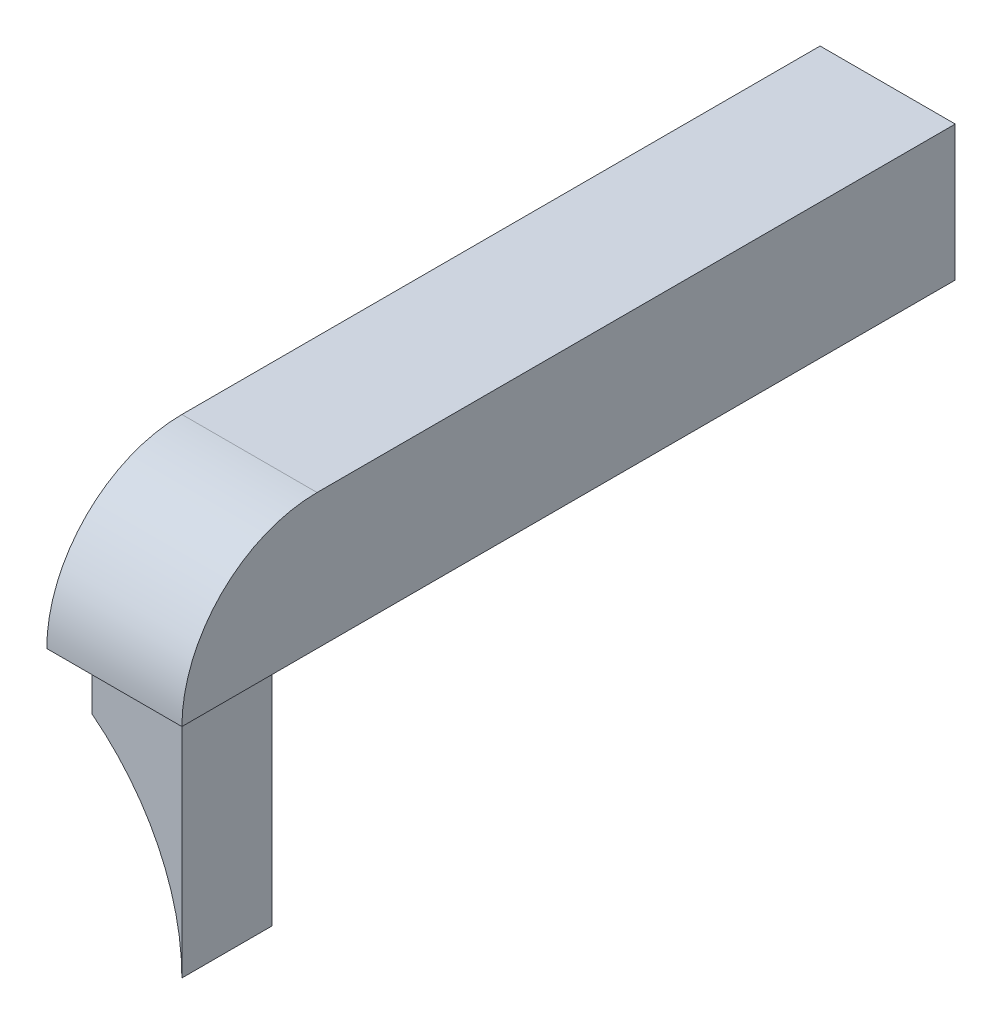
ISO-10303-21;
HEADER;
FILE_DESCRIPTION(('STEP AP214'),'2;1');
FILE_NAME('part.step','',(''),(''),'','','');
FILE_SCHEMA(('AUTOMOTIVE_DESIGN { 1 0 10303 214 1 1 1 1 }'));
ENDSEC;
DATA;
#1=APPLICATION_CONTEXT('core data for automotive mechanical design processes');
#2=APPLICATION_PROTOCOL_DEFINITION('international standard','automotive_design',2000,#1);
#3=PRODUCT_CONTEXT('',#1,'mechanical');
#4=PRODUCT('Part','Part','',(#3));
#5=PRODUCT_RELATED_PRODUCT_CATEGORY('part','',(#4));
#6=PRODUCT_DEFINITION_FORMATION('','',#4);
#7=PRODUCT_DEFINITION_CONTEXT('part definition',#1,'design');
#8=PRODUCT_DEFINITION('design','',#6,#7);
#9=PRODUCT_DEFINITION_SHAPE('','',#8);
#10=(LENGTH_UNIT() NAMED_UNIT(*) SI_UNIT(.MILLI.,.METRE.));
#11=(NAMED_UNIT(*) PLANE_ANGLE_UNIT() SI_UNIT($,.RADIAN.));
#12=(NAMED_UNIT(*) SI_UNIT($,.STERADIAN.) SOLID_ANGLE_UNIT());
#13=UNCERTAINTY_MEASURE_WITH_UNIT(LENGTH_MEASURE(1.E-05),#10,'distance_accuracy_value','');
#14=(GEOMETRIC_REPRESENTATION_CONTEXT(3) GLOBAL_UNCERTAINTY_ASSIGNED_CONTEXT((#13)) GLOBAL_UNIT_ASSIGNED_CONTEXT((#10,
#11,#12)) REPRESENTATION_CONTEXT('',''));
#15=CARTESIAN_POINT('',(0.,0.,0.));
#16=DIRECTION('',(0.,0.,1.));
#17=DIRECTION('',(1.,0.,0.));
#18=AXIS2_PLACEMENT_3D('',#15,#16,#17);
#19=CARTESIAN_POINT('',(13.7705009063984,28.2267058219209,96.5230796597994));
#20=DIRECTION('',(1.,0.,0.));
#21=DIRECTION('',(0.,0.,-1.));
#22=AXIS2_PLACEMENT_3D('',#19,#20,#21);
#23=CYLINDRICAL_SURFACE('',#22,12.4641016151377);
#24=CARTESIAN_POINT('',(26.2346025215362,28.2267058219209,96.5230796597994));
#25=DIRECTION('',(-1.,0.,0.));
#26=DIRECTION('',(0.,0.,1.));
#27=AXIS2_PLACEMENT_3D('',#24,#25,#26);
#28=CIRCLE('',#27,12.4641016151377);
#29=CARTESIAN_POINT('',(26.2346025215362,40.6908074370587,96.5230796597994));
#30=VERTEX_POINT('',#29);
#31=CARTESIAN_POINT('',(26.2346025215362,34.775828248986,107.127928763289));
#32=VERTEX_POINT('',#31);
#33=EDGE_CURVE('E249',#30,#32,#28,.F.);
#34=ORIENTED_EDGE('',*,*,#33,.T.);
#35=DIRECTION('',(1.,0.,0.));
#36=VECTOR('',#35,1.);
#37=CARTESIAN_POINT('',(13.7705009063984,34.775828248986,107.127928763289));
#38=LINE('',#37,#36);
#39=CARTESIAN_POINT('',(19.3063992912607,34.775828248986,107.127928763289));
#40=VERTEX_POINT('',#39);
#41=EDGE_CURVE('E61',#32,#40,#38,.F.);
#42=ORIENTED_EDGE('',*,*,#41,.T.);
#43=CARTESIAN_POINT('',(19.3063992912607,28.2267058219209,96.5230796597994));
#44=DIRECTION('',(1.,0.,0.));
#45=DIRECTION('',(0.,0.,-1.));
#46=AXIS2_PLACEMENT_3D('',#43,#44,#45);
#47=CIRCLE('',#46,12.4641016151377);
#48=CARTESIAN_POINT('',(19.3063992912607,40.6908074370587,96.5230796597994));
#49=VERTEX_POINT('',#48);
#50=EDGE_CURVE('E250',#49,#40,#47,.T.);
#51=ORIENTED_EDGE('',*,*,#50,.F.);
#52=DIRECTION('',(1.,0.,0.));
#53=VECTOR('',#52,1.);
#54=CARTESIAN_POINT('',(13.7705009063984,40.6908074370587,96.5230796597994));
#55=LINE('',#54,#53);
#56=EDGE_CURVE('E263',#49,#30,#55,.T.);
#57=ORIENTED_EDGE('',*,*,#56,.T.);
#58=EDGE_LOOP('',(#34,#42,#51,#57));
#59=FACE_BOUND('',#58,.T.);
#60=ADVANCED_FACE('F39',(#59),#23,.F.);
#61=CARTESIAN_POINT('',(13.7705009063984,46.2267058219209,11.5230796597994));
#62=DIRECTION('',(0.,0.,-1.));
#63=DIRECTION('',(-1.,0.,0.));
#64=AXIS2_PLACEMENT_3D('',#61,#62,#63);
#65=PLANE('',#64);
#66=DIRECTION('',(0.,1.,0.));
#67=VECTOR('',#66,1.);
#68=CARTESIAN_POINT('',(31.7705009063984,46.2267058219209,11.5230796597994));
#69=LINE('',#68,#67);
#70=CARTESIAN_POINT('',(31.7705009063984,28.2267058219209,11.5230796597994));
#71=VERTEX_POINT('',#70);
#72=CARTESIAN_POINT('',(31.7705009063984,46.2267058219209,11.5230796597994));
#73=VERTEX_POINT('',#72);
#74=EDGE_CURVE('E301',#71,#73,#69,.T.);
#75=ORIENTED_EDGE('',*,*,#74,.F.);
#76=DIRECTION('',(1.,0.,0.));
#77=VECTOR('',#76,1.);
#78=CARTESIAN_POINT('',(13.7705009063984,28.2267058219209,11.5230796597994));
#79=LINE('',#78,#77);
#80=CARTESIAN_POINT('',(13.7705009063984,28.2267058219209,11.5230796597994));
#81=VERTEX_POINT('',#80);
#82=EDGE_CURVE('E298',#81,#71,#79,.T.);
#83=ORIENTED_EDGE('',*,*,#82,.F.);
#84=DIRECTION('',(0.,1.,0.));
#85=VECTOR('',#84,1.);
#86=CARTESIAN_POINT('',(13.7705009063984,46.2267058219209,11.5230796597994));
#87=LINE('',#86,#85);
#88=CARTESIAN_POINT('',(13.7705009063984,46.2267058219209,11.5230796597994));
#89=VERTEX_POINT('',#88);
#90=EDGE_CURVE('E285',#81,#89,#87,.T.);
#91=ORIENTED_EDGE('',*,*,#90,.T.);
#92=DIRECTION('',(1.,0.,0.));
#93=VECTOR('',#92,1.);
#94=CARTESIAN_POINT('',(13.7705009063984,46.2267058219209,11.5230796597994));
#95=LINE('',#94,#93);
#96=EDGE_CURVE('E316',#89,#73,#95,.T.);
#97=ORIENTED_EDGE('',*,*,#96,.T.);
#98=EDGE_LOOP('',(#75,#83,#91,#97));
#99=FACE_BOUND('',#98,.T.);
#100=DIRECTION('',(1.,0.,0.));
#101=VECTOR('',#100,1.);
#102=CARTESIAN_POINT('',(13.7705009063984,33.7626042067832,11.5230796597994));
#103=LINE('',#102,#101);
#104=CARTESIAN_POINT('',(19.3063992912607,33.7626042067832,11.5230796597994));
#105=VERTEX_POINT('',#104);
#106=CARTESIAN_POINT('',(26.2346025215362,33.7626042067832,11.5230796597994));
#107=VERTEX_POINT('',#106);
#108=EDGE_CURVE('E253',#105,#107,#103,.T.);
#109=ORIENTED_EDGE('',*,*,#108,.T.);
#110=DIRECTION('',(0.,1.,0.));
#111=VECTOR('',#110,1.);
#112=CARTESIAN_POINT('',(26.2346025215362,46.2267058219209,11.5230796597994));
#113=LINE('',#112,#111);
#114=CARTESIAN_POINT('',(26.2346025215362,40.6908074370587,11.5230796597994));
#115=VERTEX_POINT('',#114);
#116=EDGE_CURVE('E262',#107,#115,#113,.T.);
#117=ORIENTED_EDGE('',*,*,#116,.T.);
#118=DIRECTION('',(1.,0.,0.));
#119=VECTOR('',#118,1.);
#120=CARTESIAN_POINT('',(13.7705009063984,40.6908074370587,11.5230796597994));
#121=LINE('',#120,#119);
#122=CARTESIAN_POINT('',(19.3063992912607,40.6908074370587,11.5230796597994));
#123=VERTEX_POINT('',#122);
#124=EDGE_CURVE('E267',#123,#115,#121,.T.);
#125=ORIENTED_EDGE('',*,*,#124,.F.);
#126=DIRECTION('',(0.,1.,0.));
#127=VECTOR('',#126,1.);
#128=CARTESIAN_POINT('',(19.3063992912607,28.2267058219209,11.5230796597994));
#129=LINE('',#128,#127);
#130=EDGE_CURVE('E248',#105,#123,#129,.T.);
#131=ORIENTED_EDGE('',*,*,#130,.F.);
#132=EDGE_LOOP('',(#109,#117,#125,#131));
#133=FACE_BOUND('',#132,.T.);
#134=ADVANCED_FACE('F361',(#99,#133),#65,.T.);
#135=CARTESIAN_POINT('',(13.7705009063984,28.2267058219209,114.523079659799));
#136=DIRECTION('',(1.,0.,0.));
#137=DIRECTION('',(0.,0.,-1.));
#138=AXIS2_PLACEMENT_3D('',#135,#136,#137);
#139=PLANE('',#138);
#140=DIRECTION('',(0.,0.,-1.));
#141=VECTOR('',#140,1.);
#142=CARTESIAN_POINT('',(13.7705009063984,28.2267058219209,114.523079659799));
#143=LINE('',#142,#141);
#144=CARTESIAN_POINT('',(13.7705009063984,28.2267058219209,114.523079659799));
#145=VERTEX_POINT('',#144);
#146=EDGE_CURVE('E282',#145,#81,#143,.T.);
#147=ORIENTED_EDGE('',*,*,#146,.F.);
#148=CARTESIAN_POINT('',(13.7705009063984,28.2267058219209,96.5230796597994));
#149=DIRECTION('',(1.,0.,0.));
#150=DIRECTION('',(0.,0.,1.));
#151=AXIS2_PLACEMENT_3D('',#148,#149,#150);
#152=CIRCLE('',#151,18.);
#153=CARTESIAN_POINT('',(13.7705009063984,46.2267058219209,96.5230796597994));
#154=VERTEX_POINT('',#153);
#155=EDGE_CURVE('E294',#154,#145,#152,.T.);
#156=ORIENTED_EDGE('',*,*,#155,.F.);
#157=DIRECTION('',(0.,0.,1.));
#158=VECTOR('',#157,1.);
#159=CARTESIAN_POINT('',(13.7705009063984,46.2267058219209,96.5230796597994));
#160=LINE('',#159,#158);
#161=EDGE_CURVE('E290',#89,#154,#160,.T.);
#162=ORIENTED_EDGE('',*,*,#161,.F.);
#163=ORIENTED_EDGE('',*,*,#90,.F.);
#164=EDGE_LOOP('',(#147,#156,#162,#163));
#165=FACE_BOUND('',#164,.T.);
#166=ADVANCED_FACE('F368',(#165),#139,.F.);
#167=CARTESIAN_POINT('',(13.7705009063984,46.2267058219209,96.5230796597994));
#168=DIRECTION('',(0.,1.,0.));
#169=DIRECTION('',(0.,0.,1.));
#170=AXIS2_PLACEMENT_3D('',#167,#168,#169);
#171=PLANE('',#170);
#172=DIRECTION('',(0.,0.,1.));
#173=VECTOR('',#172,1.);
#174=CARTESIAN_POINT('',(31.7705009063984,46.2267058219209,96.5230796597994));
#175=LINE('',#174,#173);
#176=CARTESIAN_POINT('',(31.7705009063984,46.2267058219209,96.5230796597994));
#177=VERTEX_POINT('',#176);
#178=EDGE_CURVE('E305',#73,#177,#175,.T.);
#179=ORIENTED_EDGE('',*,*,#178,.F.);
#180=ORIENTED_EDGE('',*,*,#96,.F.);
#181=ORIENTED_EDGE('',*,*,#161,.T.);
#182=DIRECTION('',(1.,0.,0.));
#183=VECTOR('',#182,1.);
#184=CARTESIAN_POINT('',(13.7705009063984,46.2267058219209,96.5230796597994));
#185=LINE('',#184,#183);
#186=EDGE_CURVE('E312',#154,#177,#185,.T.);
#187=ORIENTED_EDGE('',*,*,#186,.T.);
#188=EDGE_LOOP('',(#179,#180,#181,#187));
#189=FACE_BOUND('',#188,.T.);
#190=ADVANCED_FACE('F384',(#189),#171,.T.);
#191=CARTESIAN_POINT('',(31.7705009063984,28.2267058219209,114.523079659799));
#192=DIRECTION('',(-1.,0.,0.));
#193=DIRECTION('',(0.,0.,1.));
#194=AXIS2_PLACEMENT_3D('',#191,#192,#193);
#195=PLANE('',#194);
#196=CARTESIAN_POINT('',(31.7705009063984,28.2267058219209,96.5230796597994));
#197=DIRECTION('',(1.,0.,0.));
#198=DIRECTION('',(0.,0.,1.));
#199=AXIS2_PLACEMENT_3D('',#196,#197,#198);
#200=CIRCLE('',#199,18.);
#201=CARTESIAN_POINT('',(31.7705009063984,28.2267058219209,114.523079659799));
#202=VERTEX_POINT('',#201);
#203=EDGE_CURVE('E286',#177,#202,#200,.T.);
#204=ORIENTED_EDGE('',*,*,#203,.T.);
#205=DIRECTION('',(0.,0.,-1.));
#206=VECTOR('',#205,1.);
#207=CARTESIAN_POINT('',(31.7705009063984,28.2267058219209,96.5230796597994));
#208=LINE('',#207,#206);
#209=EDGE_CURVE('E266',#202,#71,#208,.T.);
#210=ORIENTED_EDGE('',*,*,#209,.T.);
#211=ORIENTED_EDGE('',*,*,#74,.T.);
#212=ORIENTED_EDGE('',*,*,#178,.T.);
#213=EDGE_LOOP('',(#204,#210,#211,#212));
#214=FACE_BOUND('',#213,.T.);
#215=ADVANCED_FACE('F382',(#214),#195,.F.);
#216=CARTESIAN_POINT('',(13.7705009063984,28.2267058219209,96.5230796597994));
#217=DIRECTION('',(1.,0.,0.));
#218=DIRECTION('',(0.,0.,-1.));
#219=AXIS2_PLACEMENT_3D('',#216,#217,#218);
#220=CYLINDRICAL_SURFACE('',#219,18.);
#221=ORIENTED_EDGE('',*,*,#203,.F.);
#222=ORIENTED_EDGE('',*,*,#186,.F.);
#223=ORIENTED_EDGE('',*,*,#155,.T.);
#224=DIRECTION('',(1.,0.,0.));
#225=VECTOR('',#224,1.);
#226=CARTESIAN_POINT('',(13.7705009063984,28.2267058219209,114.523079659799));
#227=LINE('',#226,#225);
#228=EDGE_CURVE('E315',#145,#202,#227,.T.);
#229=ORIENTED_EDGE('',*,*,#228,.T.);
#230=EDGE_LOOP('',(#221,#222,#223,#229));
#231=FACE_BOUND('',#230,.T.);
#232=ADVANCED_FACE('F379',(#231),#220,.T.);
#233=CARTESIAN_POINT('',(13.7705009063984,28.2267058219209,96.5230796597994));
#234=DIRECTION('',(0.,-1.,0.));
#235=DIRECTION('',(0.,0.,-1.));
#236=AXIS2_PLACEMENT_3D('',#233,#234,#235);
#237=PLANE('',#236);
#238=DIRECTION('',(-1.,0.,0.));
#239=VECTOR('',#238,1.);
#240=CARTESIAN_POINT('',(28.7705009063984,28.2267058219209,111.523079659799));
#241=LINE('',#240,#239);
#242=CARTESIAN_POINT('',(28.7705009063984,28.2267058219209,111.523079659799));
#243=VERTEX_POINT('',#242);
#244=CARTESIAN_POINT('',(16.7705009063984,28.2267058219209,111.523079659799));
#245=VERTEX_POINT('',#244);
#246=EDGE_CURVE('E210',#243,#245,#241,.T.);
#247=ORIENTED_EDGE('',*,*,#246,.F.);
#248=DIRECTION('',(0.,0.,-1.));
#249=VECTOR('',#248,1.);
#250=CARTESIAN_POINT('',(28.7705009063984,28.2267058219209,111.523079659799));
#251=LINE('',#250,#249);
#252=CARTESIAN_POINT('',(28.7705009063984,28.2267058219209,99.5230796597994));
#253=VERTEX_POINT('',#252);
#254=EDGE_CURVE('E236',#243,#253,#251,.T.);
#255=ORIENTED_EDGE('',*,*,#254,.T.);
#256=DIRECTION('',(-1.,0.,0.));
#257=VECTOR('',#256,1.);
#258=CARTESIAN_POINT('',(28.7705009063984,28.2267058219209,99.5230796597994));
#259=LINE('',#258,#257);
#260=CARTESIAN_POINT('',(16.7705009063984,28.2267058219209,99.5230796597994));
#261=VERTEX_POINT('',#260);
#262=EDGE_CURVE('E223',#253,#261,#259,.T.);
#263=ORIENTED_EDGE('',*,*,#262,.T.);
#264=DIRECTION('',(0.,0.,-1.));
#265=VECTOR('',#264,1.);
#266=CARTESIAN_POINT('',(16.7705009063984,28.2267058219209,111.523079659799));
#267=LINE('',#266,#265);
#268=EDGE_CURVE('E232',#245,#261,#267,.T.);
#269=ORIENTED_EDGE('',*,*,#268,.F.);
#270=EDGE_LOOP('',(#247,#255,#263,#269));
#271=FACE_BOUND('',#270,.T.);
#272=ORIENTED_EDGE('',*,*,#209,.F.);
#273=ORIENTED_EDGE('',*,*,#228,.F.);
#274=ORIENTED_EDGE('',*,*,#146,.T.);
#275=ORIENTED_EDGE('',*,*,#82,.T.);
#276=EDGE_LOOP('',(#272,#273,#274,#275));
#277=FACE_BOUND('',#276,.T.);
#278=ADVANCED_FACE('F371',(#271,#277),#237,.T.);
#279=CARTESIAN_POINT('',(19.3063992912607,28.2267058219209,114.523079659799));
#280=DIRECTION('',(1.,0.,0.));
#281=DIRECTION('',(0.,0.,-1.));
#282=AXIS2_PLACEMENT_3D('',#279,#280,#281);
#283=PLANE('',#282);
#284=DIRECTION('',(0.,-1.,0.));
#285=VECTOR('',#284,1.);
#286=CARTESIAN_POINT('',(19.3063992912607,33.8267058219209,102.058978044662));
#287=LINE('',#286,#285);
#288=CARTESIAN_POINT('',(19.3063992912607,33.7626042067832,102.058978044662));
#289=VERTEX_POINT('',#288);
#290=CARTESIAN_POINT('',(19.3063992912607,18.5248017217256,102.058978044662));
#291=VERTEX_POINT('',#290);
#292=EDGE_CURVE('E187',#289,#291,#287,.T.);
#293=ORIENTED_EDGE('',*,*,#292,.F.);
#294=DIRECTION('',(0.,0.,-1.));
#295=VECTOR('',#294,1.);
#296=CARTESIAN_POINT('',(19.3063992912607,33.7626042067832,114.523079659799));
#297=LINE('',#296,#295);
#298=EDGE_CURVE('E245',#289,#105,#297,.T.);
#299=ORIENTED_EDGE('',*,*,#298,.T.);
#300=ORIENTED_EDGE('',*,*,#130,.T.);
#301=DIRECTION('',(0.,0.,1.));
#302=VECTOR('',#301,1.);
#303=CARTESIAN_POINT('',(19.3063992912607,40.6908074370587,114.523079659799));
#304=LINE('',#303,#302);
#305=EDGE_CURVE('E254',#123,#49,#304,.T.);
#306=ORIENTED_EDGE('',*,*,#305,.T.);
#307=ORIENTED_EDGE('',*,*,#50,.T.);
#308=CARTESIAN_POINT('',(19.3063992912607,35.8267058219209,108.829591575571));
#309=DIRECTION('',(1.,0.,0.));
#310=DIRECTION('',(0.,0.,-1.));
#311=AXIS2_PLACEMENT_3D('',#308,#309,#310);
#312=CIRCLE('',#311,2.);
#313=CARTESIAN_POINT('',(19.3063992912607,33.8267058219209,108.829591575571));
#314=VERTEX_POINT('',#313);
#315=EDGE_CURVE('E11',#40,#314,#312,.F.);
#316=ORIENTED_EDGE('',*,*,#315,.T.);
#317=DIRECTION('',(0.,0.,-1.));
#318=VECTOR('',#317,1.);
#319=CARTESIAN_POINT('',(19.3063992912607,33.8267058219209,108.987181274937));
#320=LINE('',#319,#318);
#321=CARTESIAN_POINT('',(19.3063992912607,33.8267058219209,108.987181274937));
#322=VERTEX_POINT('',#321);
#323=EDGE_CURVE('E168',#322,#314,#320,.T.);
#324=ORIENTED_EDGE('',*,*,#323,.F.);
#325=DIRECTION('',(0.,-1.,0.));
#326=VECTOR('',#325,1.);
#327=CARTESIAN_POINT('',(19.3063992912607,33.8267058219209,108.987181274937));
#328=LINE('',#327,#326);
#329=CARTESIAN_POINT('',(19.3063992912607,18.5248017217256,108.987181274937));
#330=VERTEX_POINT('',#329);
#331=EDGE_CURVE('E180',#322,#330,#328,.T.);
#332=ORIENTED_EDGE('',*,*,#331,.T.);
#333=DIRECTION('',(0.,0.,-1.));
#334=VECTOR('',#333,1.);
#335=CARTESIAN_POINT('',(19.3063992912607,18.5248017217256,111.523079659799));
#336=LINE('',#335,#334);
#337=EDGE_CURVE('E334',#291,#330,#336,.F.);
#338=ORIENTED_EDGE('',*,*,#337,.F.);
#339=EDGE_LOOP('',(#293,#299,#300,#306,#307,#316,#324,#332,#338));
#340=FACE_BOUND('',#339,.T.);
#341=ADVANCED_FACE('F348',(#340),#283,.T.);
#342=CARTESIAN_POINT('',(13.7705009063984,40.6908074370587,96.5230796597994));
#343=DIRECTION('',(0.,1.,0.));
#344=DIRECTION('',(0.,0.,1.));
#345=AXIS2_PLACEMENT_3D('',#342,#343,#344);
#346=PLANE('',#345);
#347=DIRECTION('',(0.,0.,1.));
#348=VECTOR('',#347,1.);
#349=CARTESIAN_POINT('',(26.2346025215362,40.6908074370587,96.5230796597994));
#350=LINE('',#349,#348);
#351=EDGE_CURVE('E258',#115,#30,#350,.T.);
#352=ORIENTED_EDGE('',*,*,#351,.T.);
#353=ORIENTED_EDGE('',*,*,#56,.F.);
#354=ORIENTED_EDGE('',*,*,#305,.F.);
#355=ORIENTED_EDGE('',*,*,#124,.T.);
#356=EDGE_LOOP('',(#352,#353,#354,#355));
#357=FACE_BOUND('',#356,.T.);
#358=ADVANCED_FACE('F414',(#357),#346,.F.);
#359=CARTESIAN_POINT('',(26.2346025215362,28.2267058219209,114.523079659799));
#360=DIRECTION('',(-1.,0.,0.));
#361=DIRECTION('',(0.,0.,1.));
#362=AXIS2_PLACEMENT_3D('',#359,#360,#361);
#363=PLANE('',#362);
#364=DIRECTION('',(0.,0.,-1.));
#365=VECTOR('',#364,1.);
#366=CARTESIAN_POINT('',(26.2346025215362,33.7626042067832,96.5230796597994));
#367=LINE('',#366,#365);
#368=CARTESIAN_POINT('',(26.2346025215362,33.7626042067832,102.058978044662));
#369=VERTEX_POINT('',#368);
#370=EDGE_CURVE('E244',#369,#107,#367,.T.);
#371=ORIENTED_EDGE('',*,*,#370,.F.);
#372=DIRECTION('',(0.,-1.,0.));
#373=VECTOR('',#372,1.);
#374=CARTESIAN_POINT('',(26.2346025215362,33.8267058219209,102.058978044662));
#375=LINE('',#374,#373);
#376=CARTESIAN_POINT('',(26.2346025215362,8.50656409647403,102.058978044662));
#377=VERTEX_POINT('',#376);
#378=EDGE_CURVE('E181',#369,#377,#375,.T.);
#379=ORIENTED_EDGE('',*,*,#378,.T.);
#380=DIRECTION('',(0.,0.,-1.));
#381=VECTOR('',#380,1.);
#382=CARTESIAN_POINT('',(26.2346025215362,8.50656409647403,111.523079659799));
#383=LINE('',#382,#381);
#384=CARTESIAN_POINT('',(26.2346025215362,8.50656409647403,108.987181274937));
#385=VERTEX_POINT('',#384);
#386=EDGE_CURVE('E176',#385,#377,#383,.T.);
#387=ORIENTED_EDGE('',*,*,#386,.F.);
#388=DIRECTION('',(0.,-1.,0.));
#389=VECTOR('',#388,1.);
#390=CARTESIAN_POINT('',(26.2346025215362,33.8267058219209,108.987181274937));
#391=LINE('',#390,#389);
#392=CARTESIAN_POINT('',(26.2346025215362,33.8267058219209,108.987181274937));
#393=VERTEX_POINT('',#392);
#394=EDGE_CURVE('E171',#393,#385,#391,.T.);
#395=ORIENTED_EDGE('',*,*,#394,.F.);
#396=DIRECTION('',(0.,0.,1.));
#397=VECTOR('',#396,1.);
#398=CARTESIAN_POINT('',(26.2346025215362,33.8267058219209,108.987181274937));
#399=LINE('',#398,#397);
#400=CARTESIAN_POINT('',(26.2346025215362,33.8267058219209,108.829591575571));
#401=VERTEX_POINT('',#400);
#402=EDGE_CURVE('E159',#401,#393,#399,.T.);
#403=ORIENTED_EDGE('',*,*,#402,.F.);
#404=CARTESIAN_POINT('',(26.2346025215362,35.8267058219209,108.829591575571));
#405=DIRECTION('',(-1.,0.,0.));
#406=DIRECTION('',(0.,0.,1.));
#407=AXIS2_PLACEMENT_3D('',#404,#405,#406);
#408=CIRCLE('',#407,2.);
#409=EDGE_CURVE('E48',#401,#32,#408,.F.);
#410=ORIENTED_EDGE('',*,*,#409,.T.);
#411=ORIENTED_EDGE('',*,*,#33,.F.);
#412=ORIENTED_EDGE('',*,*,#351,.F.);
#413=ORIENTED_EDGE('',*,*,#116,.F.);
#414=EDGE_LOOP('',(#371,#379,#387,#395,#403,#410,#411,#412,#413));
#415=FACE_BOUND('',#414,.T.);
#416=ADVANCED_FACE('F173',(#415),#363,.T.);
#417=CARTESIAN_POINT('',(13.7705009063984,33.7626042067832,96.5230796597994));
#418=DIRECTION('',(0.,-1.,0.));
#419=DIRECTION('',(0.,0.,-1.));
#420=AXIS2_PLACEMENT_3D('',#417,#418,#419);
#421=PLANE('',#420);
#422=ORIENTED_EDGE('',*,*,#298,.F.);
#423=DIRECTION('',(1.,0.,0.));
#424=VECTOR('',#423,1.);
#425=CARTESIAN_POINT('',(13.7705009063984,33.7626042067832,102.058978044662));
#426=LINE('',#425,#424);
#427=EDGE_CURVE('E194',#289,#369,#426,.T.);
#428=ORIENTED_EDGE('',*,*,#427,.T.);
#429=ORIENTED_EDGE('',*,*,#370,.T.);
#430=ORIENTED_EDGE('',*,*,#108,.F.);
#431=EDGE_LOOP('',(#422,#428,#429,#430));
#432=FACE_BOUND('',#431,.T.);
#433=ADVANCED_FACE('F375',(#432),#421,.F.);
#434=CARTESIAN_POINT('',(-2.22949909360185,-3.77329417807921,111.523079659799));
#435=DIRECTION('',(0.,0.,-1.));
#436=DIRECTION('',(-1.,0.,0.));
#437=AXIS2_PLACEMENT_3D('',#434,#435,#436);
#438=CYLINDRICAL_SURFACE('',#437,31.0000000000003);
#439=CARTESIAN_POINT('',(-2.22949909360185,-3.77329417807921,102.058978044662));
#440=DIRECTION('',(0.,0.,-1.));
#441=DIRECTION('',(-1.,0.,0.));
#442=AXIS2_PLACEMENT_3D('',#439,#440,#441);
#443=CIRCLE('',#442,31.0000000000003);
#444=EDGE_CURVE('E325',#377,#291,#443,.F.);
#445=ORIENTED_EDGE('',*,*,#444,.T.);
#446=ORIENTED_EDGE('',*,*,#337,.T.);
#447=CARTESIAN_POINT('',(-2.22949909360185,-3.77329417807921,108.987181274937));
#448=DIRECTION('',(0.,0.,1.));
#449=DIRECTION('',(1.,0.,0.));
#450=AXIS2_PLACEMENT_3D('',#447,#448,#449);
#451=CIRCLE('',#450,31.0000000000003);
#452=EDGE_CURVE('E331',#330,#385,#451,.F.);
#453=ORIENTED_EDGE('',*,*,#452,.T.);
#454=ORIENTED_EDGE('',*,*,#386,.T.);
#455=EDGE_LOOP('',(#445,#446,#453,#454));
#456=FACE_BOUND('',#455,.T.);
#457=CARTESIAN_POINT('',(-2.22949909360185,-3.77329417807921,99.5230796597994));
#458=DIRECTION('',(0.,0.,-1.));
#459=DIRECTION('',(1.,0.,0.));
#460=AXIS2_PLACEMENT_3D('',#457,#458,#459);
#461=CIRCLE('',#460,31.0000000000003);
#462=CARTESIAN_POINT('',(16.7705009063984,20.7216032497527,99.5230796597994));
#463=VERTEX_POINT('',#462);
#464=CARTESIAN_POINT('',(28.7705009063984,-3.77329417807919,99.5230796597994));
#465=VERTEX_POINT('',#464);
#466=EDGE_CURVE('E201',#463,#465,#461,.T.);
#467=ORIENTED_EDGE('',*,*,#466,.T.);
#468=DIRECTION('',(0.,0.,-1.));
#469=VECTOR('',#468,1.);
#470=CARTESIAN_POINT('',(28.7705009063984,-3.77329417807919,111.523079659799));
#471=LINE('',#470,#469);
#472=CARTESIAN_POINT('',(28.7705009063984,-3.77329417807919,111.523079659799));
#473=VERTEX_POINT('',#472);
#474=EDGE_CURVE('E240',#473,#465,#471,.T.);
#475=ORIENTED_EDGE('',*,*,#474,.F.);
#476=CARTESIAN_POINT('',(-2.22949909360185,-3.77329417807921,111.523079659799));
#477=DIRECTION('',(0.,0.,-1.));
#478=DIRECTION('',(1.,0.,0.));
#479=AXIS2_PLACEMENT_3D('',#476,#477,#478);
#480=CIRCLE('',#479,31.0000000000003);
#481=CARTESIAN_POINT('',(16.7705009063984,20.7216032497527,111.523079659799));
#482=VERTEX_POINT('',#481);
#483=EDGE_CURVE('E202',#482,#473,#480,.T.);
#484=ORIENTED_EDGE('',*,*,#483,.F.);
#485=DIRECTION('',(0.,0.,-1.));
#486=VECTOR('',#485,1.);
#487=CARTESIAN_POINT('',(16.7705009063984,20.7216032497527,111.523079659799));
#488=LINE('',#487,#486);
#489=EDGE_CURVE('E216',#482,#463,#488,.T.);
#490=ORIENTED_EDGE('',*,*,#489,.T.);
#491=EDGE_LOOP('',(#467,#475,#484,#490));
#492=FACE_BOUND('',#491,.T.);
#493=ADVANCED_FACE('F344',(#456,#492),#438,.F.);
#494=CARTESIAN_POINT('',(28.7705009063984,-3.77329417807919,111.523079659799));
#495=DIRECTION('',(-1.,0.,0.));
#496=DIRECTION('',(0.,-1.,0.));
#497=AXIS2_PLACEMENT_3D('',#494,#495,#496);
#498=PLANE('',#497);
#499=DIRECTION('',(0.,1.,0.));
#500=VECTOR('',#499,1.);
#501=CARTESIAN_POINT('',(28.7705009063984,-3.77329417807919,99.5230796597994));
#502=LINE('',#501,#500);
#503=EDGE_CURVE('E220',#465,#253,#502,.T.);
#504=ORIENTED_EDGE('',*,*,#503,.T.);
#505=ORIENTED_EDGE('',*,*,#254,.F.);
#506=DIRECTION('',(0.,1.,0.));
#507=VECTOR('',#506,1.);
#508=CARTESIAN_POINT('',(28.7705009063984,-3.77329417807919,111.523079659799));
#509=LINE('',#508,#507);
#510=EDGE_CURVE('E206',#473,#243,#509,.T.);
#511=ORIENTED_EDGE('',*,*,#510,.F.);
#512=ORIENTED_EDGE('',*,*,#474,.T.);
#513=EDGE_LOOP('',(#504,#505,#511,#512));
#514=FACE_BOUND('',#513,.T.);
#515=ADVANCED_FACE('F427',(#514),#498,.F.);
#516=CARTESIAN_POINT('',(16.7705009063984,28.2267058219209,111.523079659799));
#517=DIRECTION('',(1.,0.,0.));
#518=DIRECTION('',(0.,0.,-1.));
#519=AXIS2_PLACEMENT_3D('',#516,#517,#518);
#520=PLANE('',#519);
#521=DIRECTION('',(0.,-1.,0.));
#522=VECTOR('',#521,1.);
#523=CARTESIAN_POINT('',(16.7705009063984,28.2267058219209,99.5230796597994));
#524=LINE('',#523,#522);
#525=EDGE_CURVE('E207',#261,#463,#524,.T.);
#526=ORIENTED_EDGE('',*,*,#525,.T.);
#527=ORIENTED_EDGE('',*,*,#489,.F.);
#528=DIRECTION('',(0.,-1.,0.));
#529=VECTOR('',#528,1.);
#530=CARTESIAN_POINT('',(16.7705009063984,28.2267058219209,111.523079659799));
#531=LINE('',#530,#529);
#532=EDGE_CURVE('E213',#245,#482,#531,.T.);
#533=ORIENTED_EDGE('',*,*,#532,.F.);
#534=ORIENTED_EDGE('',*,*,#268,.T.);
#535=EDGE_LOOP('',(#526,#527,#533,#534));
#536=FACE_BOUND('',#535,.T.);
#537=ADVANCED_FACE('F430',(#536),#520,.F.);
#538=CARTESIAN_POINT('',(-2.22949909360185,-3.77329417807921,111.523079659799));
#539=DIRECTION('',(0.,0.,1.));
#540=DIRECTION('',(1.,0.,0.));
#541=AXIS2_PLACEMENT_3D('',#538,#539,#540);
#542=PLANE('',#541);
#543=ORIENTED_EDGE('',*,*,#483,.T.);
#544=ORIENTED_EDGE('',*,*,#510,.T.);
#545=ORIENTED_EDGE('',*,*,#246,.T.);
#546=ORIENTED_EDGE('',*,*,#532,.T.);
#547=EDGE_LOOP('',(#543,#544,#545,#546));
#548=FACE_BOUND('',#547,.T.);
#549=ADVANCED_FACE('F434',(#548),#542,.T.);
#550=CARTESIAN_POINT('',(-2.22949909360185,-3.77329417807921,99.5230796597994));
#551=DIRECTION('',(0.,0.,1.));
#552=DIRECTION('',(1.,0.,0.));
#553=AXIS2_PLACEMENT_3D('',#550,#551,#552);
#554=PLANE('',#553);
#555=ORIENTED_EDGE('',*,*,#466,.F.);
#556=ORIENTED_EDGE('',*,*,#525,.F.);
#557=ORIENTED_EDGE('',*,*,#262,.F.);
#558=ORIENTED_EDGE('',*,*,#503,.F.);
#559=EDGE_LOOP('',(#555,#556,#557,#558));
#560=FACE_BOUND('',#559,.T.);
#561=ADVANCED_FACE('F436',(#560),#554,.F.);
#562=CARTESIAN_POINT('',(0.,33.8267058219209,0.));
#563=DIRECTION('',(0.,-1.,0.));
#564=DIRECTION('',(0.,0.,-1.));
#565=AXIS2_PLACEMENT_3D('',#562,#563,#564);
#566=PLANE('',#565);
#567=ORIENTED_EDGE('',*,*,#323,.T.);
#568=DIRECTION('',(-1.,0.,0.));
#569=VECTOR('',#568,1.);
#570=CARTESIAN_POINT('',(26.2346025215362,33.8267058219209,108.829591575571));
#571=LINE('',#570,#569);
#572=EDGE_CURVE('E166',#314,#401,#571,.F.);
#573=ORIENTED_EDGE('',*,*,#572,.T.);
#574=ORIENTED_EDGE('',*,*,#402,.T.);
#575=DIRECTION('',(-1.,0.,0.));
#576=VECTOR('',#575,1.);
#577=CARTESIAN_POINT('',(19.3063992912607,33.8267058219209,108.987181274937));
#578=LINE('',#577,#576);
#579=EDGE_CURVE('E164',#393,#322,#578,.T.);
#580=ORIENTED_EDGE('',*,*,#579,.T.);
#581=EDGE_LOOP('',(#567,#573,#574,#580));
#582=FACE_BOUND('',#581,.T.);
#583=ADVANCED_FACE('F162',(#582),#566,.T.);
#584=CARTESIAN_POINT('',(19.3063992912607,33.8267058219209,108.987181274937));
#585=DIRECTION('',(0.,0.,1.));
#586=DIRECTION('',(1.,0.,0.));
#587=AXIS2_PLACEMENT_3D('',#584,#585,#586);
#588=PLANE('',#587);
#589=ORIENTED_EDGE('',*,*,#331,.F.);
#590=ORIENTED_EDGE('',*,*,#579,.F.);
#591=ORIENTED_EDGE('',*,*,#394,.T.);
#592=ORIENTED_EDGE('',*,*,#452,.F.);
#593=EDGE_LOOP('',(#589,#590,#591,#592));
#594=FACE_BOUND('',#593,.T.);
#595=ADVANCED_FACE('F183',(#594),#588,.F.);
#596=CARTESIAN_POINT('',(19.3063992912607,33.8267058219209,102.058978044662));
#597=DIRECTION('',(0.,0.,-1.));
#598=DIRECTION('',(-1.,0.,0.));
#599=AXIS2_PLACEMENT_3D('',#596,#597,#598);
#600=PLANE('',#599);
#601=ORIENTED_EDGE('',*,*,#292,.T.);
#602=ORIENTED_EDGE('',*,*,#444,.F.);
#603=ORIENTED_EDGE('',*,*,#378,.F.);
#604=ORIENTED_EDGE('',*,*,#427,.F.);
#605=EDGE_LOOP('',(#601,#602,#603,#604));
#606=FACE_BOUND('',#605,.T.);
#607=ADVANCED_FACE('F354',(#606),#600,.F.);
#608=CARTESIAN_POINT('',(13.7705009063984,35.8267058219209,108.829591575571));
#609=DIRECTION('',(1.,0.,0.));
#610=DIRECTION('',(0.,0.,-1.));
#611=AXIS2_PLACEMENT_3D('',#608,#609,#610);
#612=CYLINDRICAL_SURFACE('',#611,2.);
#613=ORIENTED_EDGE('',*,*,#315,.F.);
#614=ORIENTED_EDGE('',*,*,#41,.F.);
#615=ORIENTED_EDGE('',*,*,#409,.F.);
#616=ORIENTED_EDGE('',*,*,#572,.F.);
#617=EDGE_LOOP('',(#613,#614,#615,#616));
#618=FACE_BOUND('',#617,.T.);
#619=ADVANCED_FACE('F41',(#618),#612,.T.);
#620=CLOSED_SHELL('',(#60,#134,#166,#190,#215,#232,#278,#341,#358,#416,#433,#493,#515,#537,#549,
#561,#583,#595,#607,#619));
#621=MANIFOLD_SOLID_BREP('B2',#620);
#622=ADVANCED_BREP_SHAPE_REPRESENTATION('',(#18,#621),#14);
#623=SHAPE_DEFINITION_REPRESENTATION(#9,#622);
ENDSEC;
END-ISO-10303-21;
